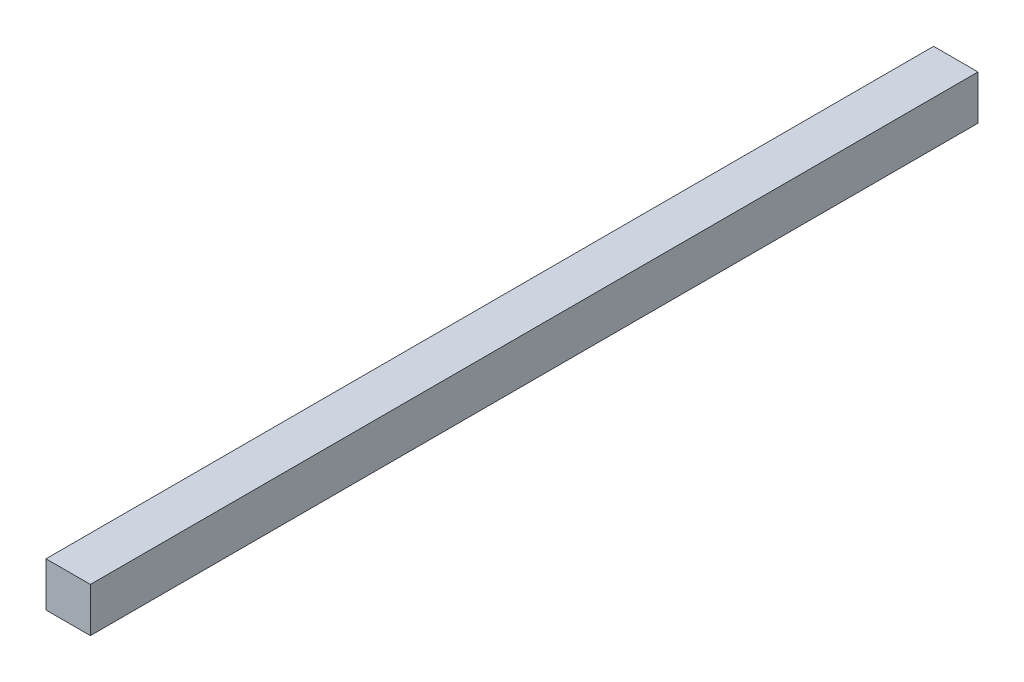
ISO-10303-21;
HEADER;
FILE_DESCRIPTION(('STEP AP214'),'2;1');
FILE_NAME('part.step','',(''),(''),'','','');
FILE_SCHEMA(('AUTOMOTIVE_DESIGN { 1 0 10303 214 1 1 1 1 }'));
ENDSEC;
DATA;
#1=APPLICATION_CONTEXT('core data for automotive mechanical design processes');
#2=APPLICATION_PROTOCOL_DEFINITION('international standard','automotive_design',2000,#1);
#3=PRODUCT_CONTEXT('',#1,'mechanical');
#4=PRODUCT('Part','Part','',(#3));
#5=PRODUCT_RELATED_PRODUCT_CATEGORY('part','',(#4));
#6=PRODUCT_DEFINITION_FORMATION('','',#4);
#7=PRODUCT_DEFINITION_CONTEXT('part definition',#1,'design');
#8=PRODUCT_DEFINITION('design','',#6,#7);
#9=PRODUCT_DEFINITION_SHAPE('','',#8);
#10=(LENGTH_UNIT() NAMED_UNIT(*) SI_UNIT(.MILLI.,.METRE.));
#11=(NAMED_UNIT(*) PLANE_ANGLE_UNIT() SI_UNIT($,.RADIAN.));
#12=(NAMED_UNIT(*) SI_UNIT($,.STERADIAN.) SOLID_ANGLE_UNIT());
#13=UNCERTAINTY_MEASURE_WITH_UNIT(LENGTH_MEASURE(1.E-05),#10,'distance_accuracy_value','');
#14=(GEOMETRIC_REPRESENTATION_CONTEXT(3) GLOBAL_UNCERTAINTY_ASSIGNED_CONTEXT((#13)) GLOBAL_UNIT_ASSIGNED_CONTEXT((#10,
#11,#12)) REPRESENTATION_CONTEXT('',''));
#15=CARTESIAN_POINT('',(0.,0.,0.));
#16=DIRECTION('',(0.,0.,1.));
#17=DIRECTION('',(1.,0.,0.));
#18=AXIS2_PLACEMENT_3D('',#15,#16,#17);
#19=CARTESIAN_POINT('',(10.,-10.,400.));
#20=DIRECTION('',(-1.,0.,0.));
#21=DIRECTION('',(0.,0.,1.));
#22=AXIS2_PLACEMENT_3D('',#19,#20,#21);
#23=PLANE('',#22);
#24=DIRECTION('',(0.,1.,0.));
#25=VECTOR('',#24,1.);
#26=CARTESIAN_POINT('',(10.,-10.,0.));
#27=LINE('',#26,#25);
#28=CARTESIAN_POINT('',(10.,-10.,0.));
#29=VERTEX_POINT('',#28);
#30=CARTESIAN_POINT('',(10.,10.,0.));
#31=VERTEX_POINT('',#30);
#32=EDGE_CURVE('E102',#29,#31,#27,.T.);
#33=ORIENTED_EDGE('',*,*,#32,.T.);
#34=DIRECTION('',(0.,0.,-1.));
#35=VECTOR('',#34,1.);
#36=CARTESIAN_POINT('',(10.,10.,400.));
#37=LINE('',#36,#35);
#38=CARTESIAN_POINT('',(10.,10.,400.));
#39=VERTEX_POINT('',#38);
#40=EDGE_CURVE('E11',#39,#31,#37,.T.);
#41=ORIENTED_EDGE('',*,*,#40,.F.);
#42=DIRECTION('',(0.,1.,0.));
#43=VECTOR('',#42,1.);
#44=CARTESIAN_POINT('',(10.,-10.,400.));
#45=LINE('',#44,#43);
#46=CARTESIAN_POINT('',(10.,-10.,400.));
#47=VERTEX_POINT('',#46);
#48=EDGE_CURVE('E90',#47,#39,#45,.T.);
#49=ORIENTED_EDGE('',*,*,#48,.F.);
#50=DIRECTION('',(0.,0.,-1.));
#51=VECTOR('',#50,1.);
#52=CARTESIAN_POINT('',(10.,-10.,400.));
#53=LINE('',#52,#51);
#54=EDGE_CURVE('E98',#47,#29,#53,.T.);
#55=ORIENTED_EDGE('',*,*,#54,.T.);
#56=EDGE_LOOP('',(#33,#41,#49,#55));
#57=FACE_BOUND('',#56,.T.);
#58=ADVANCED_FACE('F39',(#57),#23,.F.);
#59=CARTESIAN_POINT('',(-10.,10.,400.));
#60=DIRECTION('',(0.,-1.,0.));
#61=DIRECTION('',(0.,0.,-1.));
#62=AXIS2_PLACEMENT_3D('',#59,#60,#61);
#63=PLANE('',#62);
#64=DIRECTION('',(-1.,0.,0.));
#65=VECTOR('',#64,1.);
#66=CARTESIAN_POINT('',(-10.,10.,0.));
#67=LINE('',#66,#65);
#68=CARTESIAN_POINT('',(-10.,10.,0.));
#69=VERTEX_POINT('',#68);
#70=EDGE_CURVE('E94',#31,#69,#67,.T.);
#71=ORIENTED_EDGE('',*,*,#70,.T.);
#72=DIRECTION('',(0.,0.,-1.));
#73=VECTOR('',#72,1.);
#74=CARTESIAN_POINT('',(-10.,10.,400.));
#75=LINE('',#74,#73);
#76=CARTESIAN_POINT('',(-10.,10.,400.));
#77=VERTEX_POINT('',#76);
#78=EDGE_CURVE('E47',#77,#69,#75,.T.);
#79=ORIENTED_EDGE('',*,*,#78,.F.);
#80=DIRECTION('',(-1.,0.,0.));
#81=VECTOR('',#80,1.);
#82=CARTESIAN_POINT('',(-10.,10.,400.));
#83=LINE('',#82,#81);
#84=EDGE_CURVE('E85',#39,#77,#83,.T.);
#85=ORIENTED_EDGE('',*,*,#84,.F.);
#86=ORIENTED_EDGE('',*,*,#40,.T.);
#87=EDGE_LOOP('',(#71,#79,#85,#86));
#88=FACE_BOUND('',#87,.T.);
#89=ADVANCED_FACE('F93',(#88),#63,.F.);
#90=CARTESIAN_POINT('',(-10.,-10.,400.));
#91=DIRECTION('',(1.,0.,0.));
#92=DIRECTION('',(0.,0.,-1.));
#93=AXIS2_PLACEMENT_3D('',#90,#91,#92);
#94=PLANE('',#93);
#95=DIRECTION('',(0.,-1.,0.));
#96=VECTOR('',#95,1.);
#97=CARTESIAN_POINT('',(-10.,-10.,0.));
#98=LINE('',#97,#96);
#99=CARTESIAN_POINT('',(-10.,-10.,0.));
#100=VERTEX_POINT('',#99);
#101=EDGE_CURVE('E72',#69,#100,#98,.T.);
#102=ORIENTED_EDGE('',*,*,#101,.T.);
#103=DIRECTION('',(0.,0.,-1.));
#104=VECTOR('',#103,1.);
#105=CARTESIAN_POINT('',(-10.,-10.,400.));
#106=LINE('',#105,#104);
#107=CARTESIAN_POINT('',(-10.,-10.,400.));
#108=VERTEX_POINT('',#107);
#109=EDGE_CURVE('E95',#108,#100,#106,.T.);
#110=ORIENTED_EDGE('',*,*,#109,.F.);
#111=DIRECTION('',(0.,-1.,0.));
#112=VECTOR('',#111,1.);
#113=CARTESIAN_POINT('',(-10.,-10.,400.));
#114=LINE('',#113,#112);
#115=EDGE_CURVE('E88',#77,#108,#114,.T.);
#116=ORIENTED_EDGE('',*,*,#115,.F.);
#117=ORIENTED_EDGE('',*,*,#78,.T.);
#118=EDGE_LOOP('',(#102,#110,#116,#117));
#119=FACE_BOUND('',#118,.T.);
#120=ADVANCED_FACE('F96',(#119),#94,.F.);
#121=CARTESIAN_POINT('',(-10.,-10.,400.));
#122=DIRECTION('',(0.,1.,0.));
#123=DIRECTION('',(0.,0.,1.));
#124=AXIS2_PLACEMENT_3D('',#121,#122,#123);
#125=PLANE('',#124);
#126=DIRECTION('',(1.,0.,0.));
#127=VECTOR('',#126,1.);
#128=CARTESIAN_POINT('',(-10.,-10.,0.));
#129=LINE('',#128,#127);
#130=EDGE_CURVE('E78',#100,#29,#129,.T.);
#131=ORIENTED_EDGE('',*,*,#130,.T.);
#132=ORIENTED_EDGE('',*,*,#54,.F.);
#133=DIRECTION('',(1.,0.,0.));
#134=VECTOR('',#133,1.);
#135=CARTESIAN_POINT('',(-10.,-10.,400.));
#136=LINE('',#135,#134);
#137=EDGE_CURVE('E55',#108,#47,#136,.T.);
#138=ORIENTED_EDGE('',*,*,#137,.F.);
#139=ORIENTED_EDGE('',*,*,#109,.T.);
#140=EDGE_LOOP('',(#131,#132,#138,#139));
#141=FACE_BOUND('',#140,.T.);
#142=ADVANCED_FACE('F109',(#141),#125,.F.);
#143=CARTESIAN_POINT('',(0.,0.,400.));
#144=DIRECTION('',(0.,0.,-1.));
#145=DIRECTION('',(-1.,0.,0.));
#146=AXIS2_PLACEMENT_3D('',#143,#144,#145);
#147=PLANE('',#146);
#148=ORIENTED_EDGE('',*,*,#48,.T.);
#149=ORIENTED_EDGE('',*,*,#84,.T.);
#150=ORIENTED_EDGE('',*,*,#115,.T.);
#151=ORIENTED_EDGE('',*,*,#137,.T.);
#152=EDGE_LOOP('',(#148,#149,#150,#151));
#153=FACE_BOUND('',#152,.T.);
#154=ADVANCED_FACE('F86',(#153),#147,.F.);
#155=CARTESIAN_POINT('',(0.,0.,0.));
#156=DIRECTION('',(0.,0.,-1.));
#157=DIRECTION('',(-1.,0.,0.));
#158=AXIS2_PLACEMENT_3D('',#155,#156,#157);
#159=PLANE('',#158);
#160=ORIENTED_EDGE('',*,*,#32,.F.);
#161=ORIENTED_EDGE('',*,*,#130,.F.);
#162=ORIENTED_EDGE('',*,*,#101,.F.);
#163=ORIENTED_EDGE('',*,*,#70,.F.);
#164=EDGE_LOOP('',(#160,#161,#162,#163));
#165=FACE_BOUND('',#164,.T.);
#166=ADVANCED_FACE('F112',(#165),#159,.T.);
#167=CLOSED_SHELL('',(#58,#89,#120,#142,#154,#166));
#168=MANIFOLD_SOLID_BREP('B2',#167);
#169=ADVANCED_BREP_SHAPE_REPRESENTATION('',(#18,#168),#14);
#170=SHAPE_DEFINITION_REPRESENTATION(#9,#169);
ENDSEC;
END-ISO-10303-21;
